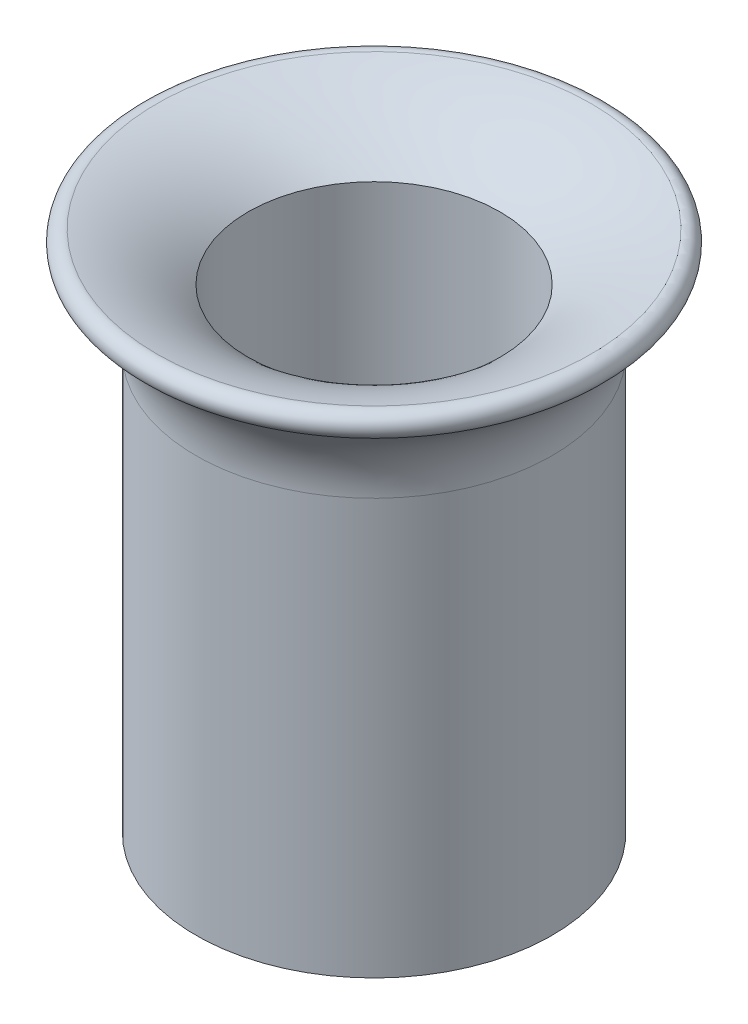
ISO-10303-21;
HEADER;
FILE_DESCRIPTION(('STEP AP214'),'2;1');
FILE_NAME('part.step','',(''),(''),'','','');
FILE_SCHEMA(('AUTOMOTIVE_DESIGN { 1 0 10303 214 1 1 1 1 }'));
ENDSEC;
DATA;
#1=APPLICATION_CONTEXT('core data for automotive mechanical design processes');
#2=APPLICATION_PROTOCOL_DEFINITION('international standard','automotive_design',2000,#1);
#3=PRODUCT_CONTEXT('',#1,'mechanical');
#4=PRODUCT('Part','Part','',(#3));
#5=PRODUCT_RELATED_PRODUCT_CATEGORY('part','',(#4));
#6=PRODUCT_DEFINITION_FORMATION('','',#4);
#7=PRODUCT_DEFINITION_CONTEXT('part definition',#1,'design');
#8=PRODUCT_DEFINITION('design','',#6,#7);
#9=PRODUCT_DEFINITION_SHAPE('','',#8);
#10=(LENGTH_UNIT() NAMED_UNIT(*) SI_UNIT(.MILLI.,.METRE.));
#11=(NAMED_UNIT(*) PLANE_ANGLE_UNIT() SI_UNIT($,.RADIAN.));
#12=(NAMED_UNIT(*) SI_UNIT($,.STERADIAN.) SOLID_ANGLE_UNIT());
#13=UNCERTAINTY_MEASURE_WITH_UNIT(LENGTH_MEASURE(1.E-05),#10,'distance_accuracy_value','');
#14=(GEOMETRIC_REPRESENTATION_CONTEXT(3) GLOBAL_UNCERTAINTY_ASSIGNED_CONTEXT((#13)) GLOBAL_UNIT_ASSIGNED_CONTEXT((#10,
#11,#12)) REPRESENTATION_CONTEXT('',''));
#15=CARTESIAN_POINT('',(0.,0.,0.));
#16=DIRECTION('',(0.,0.,1.));
#17=DIRECTION('',(1.,0.,0.));
#18=AXIS2_PLACEMENT_3D('',#15,#16,#17);
#19=CARTESIAN_POINT('',(30.,0.,0.));
#20=DIRECTION('',(0.,-1.,0.));
#21=DIRECTION('',(0.,0.,-1.));
#22=AXIS2_PLACEMENT_3D('',#19,#20,#21);
#23=CYLINDRICAL_SURFACE('',#22,30.);
#24=CARTESIAN_POINT('',(30.,0.,0.));
#25=DIRECTION('',(0.,-1.,0.));
#26=DIRECTION('',(0.,0.,-1.));
#27=AXIS2_PLACEMENT_3D('',#24,#25,#26);
#28=CIRCLE('',#27,30.);
#29=CARTESIAN_POINT('',(30.,0.,-30.));
#30=VERTEX_POINT('',#29);
#31=EDGE_CURVE('E59',#30,#30,#28,.T.);
#32=ORIENTED_EDGE('',*,*,#31,.F.);
#33=EDGE_LOOP('',(#32));
#34=FACE_BOUND('',#33,.T.);
#35=CARTESIAN_POINT('',(30.,70.0118837344222,0.));
#36=DIRECTION('',(0.,-1.,0.));
#37=DIRECTION('',(0.,0.,-1.));
#38=AXIS2_PLACEMENT_3D('',#35,#36,#37);
#39=CIRCLE('',#38,30.);
#40=CARTESIAN_POINT('',(30.,70.0118837344222,-30.));
#41=VERTEX_POINT('',#40);
#42=EDGE_CURVE('E10',#41,#41,#39,.T.);
#43=ORIENTED_EDGE('',*,*,#42,.T.);
#44=EDGE_LOOP('',(#43));
#45=FACE_BOUND('',#44,.T.);
#46=ADVANCED_FACE('F45',(#34,#45),#23,.T.);
#47=CARTESIAN_POINT('',(30.,70.0118837344222,0.));
#48=DIRECTION('',(0.,-1.,0.));
#49=DIRECTION('',(0.,0.,-1.));
#50=AXIS2_PLACEMENT_3D('',#47,#48,#49);
#51=TOROIDAL_SURFACE('',#50,47.,17.);
#52=ORIENTED_EDGE('',*,*,#42,.F.);
#53=EDGE_LOOP('',(#52));
#54=FACE_BOUND('',#53,.T.);
#55=CARTESIAN_POINT('',(30.,84.4846272846988,0.));
#56=DIRECTION('',(0.,-1.,0.));
#57=DIRECTION('',(0.,0.,-1.));
#58=AXIS2_PLACEMENT_3D('',#55,#56,#57);
#59=CIRCLE('',#58,38.0814970915558);
#60=CARTESIAN_POINT('',(30.,84.4846272846988,-38.0814970915558));
#61=VERTEX_POINT('',#60);
#62=EDGE_CURVE('E51',#61,#61,#59,.T.);
#63=ORIENTED_EDGE('',*,*,#62,.T.);
#64=EDGE_LOOP('',(#63));
#65=FACE_BOUND('',#64,.T.);
#66=ADVANCED_FACE('F92',(#54,#65),#51,.F.);
#67=CARTESIAN_POINT('',(30.,86.187302996496,0.));
#68=DIRECTION('',(0.,-1.,0.));
#69=DIRECTION('',(0.,0.,-1.));
#70=AXIS2_PLACEMENT_3D('',#67,#68,#69);
#71=TOROIDAL_SURFACE('',#70,37.0322614552682,2.);
#72=ORIENTED_EDGE('',*,*,#62,.F.);
#73=EDGE_LOOP('',(#72));
#74=FACE_BOUND('',#73,.T.);
#75=CARTESIAN_POINT('',(30.,88.134995516001,0.));
#76=DIRECTION('',(0.,-1.,0.));
#77=DIRECTION('',(0.,0.,-1.));
#78=AXIS2_PLACEMENT_3D('',#75,#76,#77);
#79=CIRCLE('',#78,36.5778455120355);
#80=CARTESIAN_POINT('',(30.,88.134995516001,-36.5778455120355));
#81=VERTEX_POINT('',#80);
#82=EDGE_CURVE('E55',#81,#81,#79,.T.);
#83=ORIENTED_EDGE('',*,*,#82,.T.);
#84=EDGE_LOOP('',(#83));
#85=FACE_BOUND('',#84,.T.);
#86=ADVANCED_FACE('F82',(#74,#85),#71,.T.);
#87=CARTESIAN_POINT('',(30.,55.0242226844152,0.));
#88=DIRECTION('',(0.,-1.,0.));
#89=DIRECTION('',(0.,0.,-1.));
#90=AXIS2_PLACEMENT_3D('',#87,#88,#89);
#91=TOROIDAL_SURFACE('',#90,44.3029165469916,34.);
#92=ORIENTED_EDGE('',*,*,#82,.F.);
#93=EDGE_LOOP('',(#92));
#94=FACE_BOUND('',#93,.T.);
#95=CARTESIAN_POINT('',(30.,80.,0.));
#96=DIRECTION('',(0.,1.,0.));
#97=DIRECTION('',(0.,0.,1.));
#98=AXIS2_PLACEMENT_3D('',#95,#96,#97);
#99=CIRCLE('',#98,21.2332276136245);
#100=CARTESIAN_POINT('',(30.,80.,21.2332276136245));
#101=VERTEX_POINT('',#100);
#102=EDGE_CURVE('E65',#101,#101,#99,.T.);
#103=ORIENTED_EDGE('',*,*,#102,.F.);
#104=EDGE_LOOP('',(#103));
#105=FACE_BOUND('',#104,.T.);
#106=ADVANCED_FACE('F80',(#94,#105),#91,.T.);
#107=CARTESIAN_POINT('',(0.,0.,0.));
#108=DIRECTION('',(0.,1.,0.));
#109=DIRECTION('',(0.,0.,1.));
#110=AXIS2_PLACEMENT_3D('',#107,#108,#109);
#111=PLANE('',#110);
#112=ORIENTED_EDGE('',*,*,#31,.T.);
#113=EDGE_LOOP('',(#112));
#114=FACE_BOUND('',#113,.T.);
#115=ADVANCED_FACE('F76',(#114),#111,.F.);
#116=CARTESIAN_POINT('',(30.,9.99999999999999,0.));
#117=DIRECTION('',(0.,1.,0.));
#118=DIRECTION('',(0.,0.,1.));
#119=AXIS2_PLACEMENT_3D('',#116,#117,#118);
#120=CYLINDRICAL_SURFACE('',#119,21.2332276136245);
#121=CARTESIAN_POINT('',(30.,9.99999999999999,0.));
#122=DIRECTION('',(0.,1.,0.));
#123=DIRECTION('',(0.,0.,1.));
#124=AXIS2_PLACEMENT_3D('',#121,#122,#123);
#125=CIRCLE('',#124,21.2332276136245);
#126=CARTESIAN_POINT('',(30.,9.99999999999999,21.2332276136245));
#127=VERTEX_POINT('',#126);
#128=EDGE_CURVE('E64',#127,#127,#125,.T.);
#129=ORIENTED_EDGE('',*,*,#128,.F.);
#130=EDGE_LOOP('',(#129));
#131=FACE_BOUND('',#130,.T.);
#132=ORIENTED_EDGE('',*,*,#102,.T.);
#133=EDGE_LOOP('',(#132));
#134=FACE_BOUND('',#133,.T.);
#135=ADVANCED_FACE('F73',(#131,#134),#120,.F.);
#136=CARTESIAN_POINT('',(30.,9.99999999999999,0.));
#137=DIRECTION('',(0.,1.,0.));
#138=DIRECTION('',(0.,0.,1.));
#139=AXIS2_PLACEMENT_3D('',#136,#137,#138);
#140=PLANE('',#139);
#141=ORIENTED_EDGE('',*,*,#128,.T.);
#142=EDGE_LOOP('',(#141));
#143=FACE_BOUND('',#142,.T.);
#144=ADVANCED_FACE('F71',(#143),#140,.T.);
#145=CLOSED_SHELL('',(#46,#66,#86,#106,#115,#135,#144));
#146=MANIFOLD_SOLID_BREP('B2',#145);
#147=ADVANCED_BREP_SHAPE_REPRESENTATION('',(#18,#146),#14);
#148=SHAPE_DEFINITION_REPRESENTATION(#9,#147);
ENDSEC;
END-ISO-10303-21;
